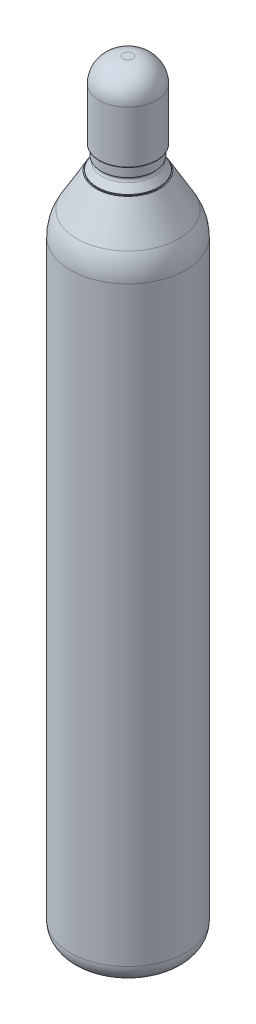
ISO-10303-21;
HEADER;
FILE_DESCRIPTION(('STEP AP214'),'2;1');
FILE_NAME('part.step','',(''),(''),'','','');
FILE_SCHEMA(('AUTOMOTIVE_DESIGN { 1 0 10303 214 1 1 1 1 }'));
ENDSEC;
DATA;
#1=APPLICATION_CONTEXT('core data for automotive mechanical design processes');
#2=APPLICATION_PROTOCOL_DEFINITION('international standard','automotive_design',2000,#1);
#3=PRODUCT_CONTEXT('',#1,'mechanical');
#4=PRODUCT('Part','Part','',(#3));
#5=PRODUCT_RELATED_PRODUCT_CATEGORY('part','',(#4));
#6=PRODUCT_DEFINITION_FORMATION('','',#4);
#7=PRODUCT_DEFINITION_CONTEXT('part definition',#1,'design');
#8=PRODUCT_DEFINITION('design','',#6,#7);
#9=PRODUCT_DEFINITION_SHAPE('','',#8);
#10=(LENGTH_UNIT() NAMED_UNIT(*) SI_UNIT(.MILLI.,.METRE.));
#11=(NAMED_UNIT(*) PLANE_ANGLE_UNIT() SI_UNIT($,.RADIAN.));
#12=(NAMED_UNIT(*) SI_UNIT($,.STERADIAN.) SOLID_ANGLE_UNIT());
#13=UNCERTAINTY_MEASURE_WITH_UNIT(LENGTH_MEASURE(1.E-05),#10,'distance_accuracy_value','');
#14=(GEOMETRIC_REPRESENTATION_CONTEXT(3) GLOBAL_UNCERTAINTY_ASSIGNED_CONTEXT((#13)) GLOBAL_UNIT_ASSIGNED_CONTEXT((#10,
#11,#12)) REPRESENTATION_CONTEXT('',''));
#15=CARTESIAN_POINT('',(0.,0.,0.));
#16=DIRECTION('',(0.,0.,1.));
#17=DIRECTION('',(1.,0.,0.));
#18=AXIS2_PLACEMENT_3D('',#15,#16,#17);
#19=CARTESIAN_POINT('',(-4.99999999999982,800.,0.));
#20=DIRECTION('',(0.,1.,0.));
#21=DIRECTION('',(0.,0.,1.));
#22=AXIS2_PLACEMENT_3D('',#19,#20,#21);
#23=PLANE('',#22);
#24=CARTESIAN_POINT('',(0.,800.,0.));
#25=DIRECTION('',(0.,1.,0.));
#26=DIRECTION('',(0.,0.,1.));
#27=AXIS2_PLACEMENT_3D('',#24,#25,#26);
#28=CIRCLE('',#27,4.99999999999983);
#29=CARTESIAN_POINT('',(0.,800.,4.99999999999983));
#30=VERTEX_POINT('',#29);
#31=EDGE_CURVE('E83',#30,#30,#28,.T.);
#32=ORIENTED_EDGE('',*,*,#31,.T.);
#33=EDGE_LOOP('',(#32));
#34=FACE_BOUND('',#33,.T.);
#35=ADVANCED_FACE('F32',(#34),#23,.T.);
#36=CARTESIAN_POINT('',(0.,775.,0.));
#37=DIRECTION('',(0.,1.,0.));
#38=DIRECTION('',(0.,0.,1.));
#39=AXIS2_PLACEMENT_3D('',#36,#37,#38);
#40=DEGENERATE_TOROIDAL_SURFACE('',#39,5.,25.,.T.);
#41=CARTESIAN_POINT('',(0.,775.,0.));
#42=DIRECTION('',(0.,1.,0.));
#43=DIRECTION('',(0.,0.,1.));
#44=AXIS2_PLACEMENT_3D('',#41,#42,#43);
#45=CIRCLE('',#44,30.);
#46=CARTESIAN_POINT('',(0.,775.,30.));
#47=VERTEX_POINT('',#46);
#48=EDGE_CURVE('E86',#47,#47,#45,.T.);
#49=ORIENTED_EDGE('',*,*,#48,.T.);
#50=EDGE_LOOP('',(#49));
#51=FACE_BOUND('',#50,.T.);
#52=ORIENTED_EDGE('',*,*,#31,.F.);
#53=EDGE_LOOP('',(#52));
#54=FACE_BOUND('',#53,.T.);
#55=ADVANCED_FACE('F148',(#51,#54),#40,.T.);
#56=CARTESIAN_POINT('',(0.,0.,0.));
#57=DIRECTION('',(0.,1.,0.));
#58=DIRECTION('',(0.,0.,1.));
#59=AXIS2_PLACEMENT_3D('',#56,#57,#58);
#60=CYLINDRICAL_SURFACE('',#59,30.);
#61=CARTESIAN_POINT('',(0.,721.,0.));
#62=DIRECTION('',(0.,1.,0.));
#63=DIRECTION('',(0.,0.,1.));
#64=AXIS2_PLACEMENT_3D('',#61,#62,#63);
#65=CIRCLE('',#64,30.);
#66=CARTESIAN_POINT('',(0.,721.,30.));
#67=VERTEX_POINT('',#66);
#68=EDGE_CURVE('E89',#67,#67,#65,.T.);
#69=ORIENTED_EDGE('',*,*,#68,.T.);
#70=EDGE_LOOP('',(#69));
#71=FACE_BOUND('',#70,.T.);
#72=ORIENTED_EDGE('',*,*,#48,.F.);
#73=EDGE_LOOP('',(#72));
#74=FACE_BOUND('',#73,.T.);
#75=ADVANCED_FACE('F154',(#71,#74),#60,.T.);
#76=CARTESIAN_POINT('',(0.,721.,0.));
#77=DIRECTION('',(0.,1.,0.));
#78=DIRECTION('',(0.,0.,1.));
#79=AXIS2_PLACEMENT_3D('',#76,#77,#78);
#80=TOROIDAL_SURFACE('',#79,29.,1.);
#81=CARTESIAN_POINT('',(0.,720.,0.));
#82=DIRECTION('',(0.,1.,0.));
#83=DIRECTION('',(0.,0.,1.));
#84=AXIS2_PLACEMENT_3D('',#81,#82,#83);
#85=CIRCLE('',#84,29.);
#86=CARTESIAN_POINT('',(0.,720.,29.));
#87=VERTEX_POINT('',#86);
#88=EDGE_CURVE('E92',#87,#87,#85,.T.);
#89=ORIENTED_EDGE('',*,*,#88,.T.);
#90=EDGE_LOOP('',(#89));
#91=FACE_BOUND('',#90,.T.);
#92=ORIENTED_EDGE('',*,*,#68,.F.);
#93=EDGE_LOOP('',(#92));
#94=FACE_BOUND('',#93,.T.);
#95=ADVANCED_FACE('F429',(#91,#94),#80,.T.);
#96=CARTESIAN_POINT('',(-29.,720.,0.));
#97=DIRECTION('',(0.,-1.,0.));
#98=DIRECTION('',(0.,0.,-1.));
#99=AXIS2_PLACEMENT_3D('',#96,#97,#98);
#100=PLANE('',#99);
#101=CARTESIAN_POINT('',(0.,720.,0.));
#102=DIRECTION('',(0.,1.,0.));
#103=DIRECTION('',(0.,0.,1.));
#104=AXIS2_PLACEMENT_3D('',#101,#102,#103);
#105=CIRCLE('',#104,28.9);
#106=CARTESIAN_POINT('',(0.,720.,28.9));
#107=VERTEX_POINT('',#106);
#108=EDGE_CURVE('E95',#107,#107,#105,.T.);
#109=ORIENTED_EDGE('',*,*,#108,.T.);
#110=EDGE_LOOP('',(#109));
#111=FACE_BOUND('',#110,.T.);
#112=ORIENTED_EDGE('',*,*,#88,.F.);
#113=EDGE_LOOP('',(#112));
#114=FACE_BOUND('',#113,.T.);
#115=ADVANCED_FACE('F419',(#111,#114),#100,.T.);
#116=CARTESIAN_POINT('',(0.,719.1,0.));
#117=DIRECTION('',(0.,1.,0.));
#118=DIRECTION('',(0.,0.,1.));
#119=AXIS2_PLACEMENT_3D('',#116,#117,#118);
#120=TOROIDAL_SURFACE('',#119,28.9,0.900000000000005);
#121=CARTESIAN_POINT('',(0.,719.1,0.));
#122=DIRECTION('',(0.,1.,0.));
#123=DIRECTION('',(0.,0.,1.));
#124=AXIS2_PLACEMENT_3D('',#121,#122,#123);
#125=CIRCLE('',#124,28.);
#126=CARTESIAN_POINT('',(0.,719.1,28.));
#127=VERTEX_POINT('',#126);
#128=EDGE_CURVE('E98',#127,#127,#125,.T.);
#129=ORIENTED_EDGE('',*,*,#128,.T.);
#130=EDGE_LOOP('',(#129));
#131=FACE_BOUND('',#130,.T.);
#132=ORIENTED_EDGE('',*,*,#108,.F.);
#133=EDGE_LOOP('',(#132));
#134=FACE_BOUND('',#133,.T.);
#135=ADVANCED_FACE('F409',(#131,#134),#120,.F.);
#136=CARTESIAN_POINT('',(0.,0.,0.));
#137=DIRECTION('',(0.,1.,0.));
#138=DIRECTION('',(0.,0.,1.));
#139=AXIS2_PLACEMENT_3D('',#136,#137,#138);
#140=CYLINDRICAL_SURFACE('',#139,28.);
#141=CARTESIAN_POINT('',(0.,710.,0.));
#142=DIRECTION('',(0.,1.,0.));
#143=DIRECTION('',(0.,0.,1.));
#144=AXIS2_PLACEMENT_3D('',#141,#142,#143);
#145=CIRCLE('',#144,28.);
#146=CARTESIAN_POINT('',(0.,710.,28.));
#147=VERTEX_POINT('',#146);
#148=EDGE_CURVE('E101',#147,#147,#145,.T.);
#149=ORIENTED_EDGE('',*,*,#148,.T.);
#150=EDGE_LOOP('',(#149));
#151=FACE_BOUND('',#150,.T.);
#152=ORIENTED_EDGE('',*,*,#128,.F.);
#153=EDGE_LOOP('',(#152));
#154=FACE_BOUND('',#153,.T.);
#155=ADVANCED_FACE('F399',(#151,#154),#140,.T.);
#156=CARTESIAN_POINT('',(-28.,710.,0.));
#157=DIRECTION('',(0.,-1.,0.));
#158=DIRECTION('',(0.,0.,-1.));
#159=AXIS2_PLACEMENT_3D('',#156,#157,#158);
#160=PLANE('',#159);
#161=CARTESIAN_POINT('',(0.,710.,0.));
#162=DIRECTION('',(0.,1.,0.));
#163=DIRECTION('',(0.,0.,1.));
#164=AXIS2_PLACEMENT_3D('',#161,#162,#163);
#165=CIRCLE('',#164,26.);
#166=CARTESIAN_POINT('',(0.,710.,26.));
#167=VERTEX_POINT('',#166);
#168=EDGE_CURVE('E104',#167,#167,#165,.T.);
#169=ORIENTED_EDGE('',*,*,#168,.T.);
#170=EDGE_LOOP('',(#169));
#171=FACE_BOUND('',#170,.T.);
#172=ORIENTED_EDGE('',*,*,#148,.F.);
#173=EDGE_LOOP('',(#172));
#174=FACE_BOUND('',#173,.T.);
#175=ADVANCED_FACE('F389',(#171,#174),#160,.T.);
#176=CARTESIAN_POINT('',(0.,0.,0.));
#177=DIRECTION('',(0.,1.,0.));
#178=DIRECTION('',(0.,0.,1.));
#179=AXIS2_PLACEMENT_3D('',#176,#177,#178);
#180=CYLINDRICAL_SURFACE('',#179,26.);
#181=CARTESIAN_POINT('',(0.,707.623068324057,0.));
#182=DIRECTION('',(0.,1.,0.));
#183=DIRECTION('',(0.,0.,1.));
#184=AXIS2_PLACEMENT_3D('',#181,#182,#183);
#185=CIRCLE('',#184,26.);
#186=CARTESIAN_POINT('',(0.,707.623068324057,26.));
#187=VERTEX_POINT('',#186);
#188=EDGE_CURVE('E107',#187,#187,#185,.T.);
#189=ORIENTED_EDGE('',*,*,#188,.T.);
#190=EDGE_LOOP('',(#189));
#191=FACE_BOUND('',#190,.T.);
#192=ORIENTED_EDGE('',*,*,#168,.F.);
#193=EDGE_LOOP('',(#192));
#194=FACE_BOUND('',#193,.T.);
#195=ADVANCED_FACE('F379',(#191,#194),#180,.T.);
#196=CARTESIAN_POINT('',(0.,707.623068324057,0.));
#197=DIRECTION('',(0.,1.,0.));
#198=DIRECTION('',(0.,0.,1.));
#199=AXIS2_PLACEMENT_3D('',#196,#197,#198);
#200=TOROIDAL_SURFACE('',#199,31.,5.00000000000002);
#201=CARTESIAN_POINT('',(0.,704.686382138247,0.));
#202=DIRECTION('',(0.,1.,0.));
#203=DIRECTION('',(0.,0.,1.));
#204=AXIS2_PLACEMENT_3D('',#201,#202,#203);
#205=CIRCLE('',#204,26.9532884651767);
#206=CARTESIAN_POINT('',(0.,704.686382138247,26.9532884651767));
#207=VERTEX_POINT('',#206);
#208=EDGE_CURVE('E110',#207,#207,#205,.T.);
#209=ORIENTED_EDGE('',*,*,#208,.T.);
#210=EDGE_LOOP('',(#209));
#211=FACE_BOUND('',#210,.T.);
#212=ORIENTED_EDGE('',*,*,#188,.F.);
#213=EDGE_LOOP('',(#212));
#214=FACE_BOUND('',#213,.T.);
#215=ADVANCED_FACE('F369',(#211,#214),#200,.F.);
#216=CARTESIAN_POINT('',(0.,704.686382138247,0.));
#217=DIRECTION('',(0.,-1.,0.));
#218=DIRECTION('',(0.,0.,-1.));
#219=AXIS2_PLACEMENT_3D('',#216,#217,#218);
#220=CONICAL_SURFACE('',#219,26.9532884651767,0.627764864892792);
#221=CARTESIAN_POINT('',(0.,697.602540378444,0.));
#222=DIRECTION('',(0.,1.,0.));
#223=DIRECTION('',(0.,0.,1.));
#224=AXIS2_PLACEMENT_3D('',#221,#222,#223);
#225=CIRCLE('',#224,32.0940107675849);
#226=CARTESIAN_POINT('',(0.,697.602540378444,32.0940107675849));
#227=VERTEX_POINT('',#226);
#228=EDGE_CURVE('E113',#227,#227,#225,.T.);
#229=ORIENTED_EDGE('',*,*,#228,.T.);
#230=EDGE_LOOP('',(#229));
#231=FACE_BOUND('',#230,.T.);
#232=ORIENTED_EDGE('',*,*,#208,.F.);
#233=EDGE_LOOP('',(#232));
#234=FACE_BOUND('',#233,.T.);
#235=ADVANCED_FACE('F359',(#231,#234),#220,.T.);
#236=CARTESIAN_POINT('',(0.,0.,0.));
#237=DIRECTION('',(0.,1.,0.));
#238=DIRECTION('',(0.,0.,1.));
#239=AXIS2_PLACEMENT_3D('',#236,#237,#238);
#240=CYLINDRICAL_SURFACE('',#239,32.0940107675849);
#241=CARTESIAN_POINT('',(0.,696.602540378444,0.));
#242=DIRECTION('',(0.,1.,0.));
#243=DIRECTION('',(0.,0.,1.));
#244=AXIS2_PLACEMENT_3D('',#241,#242,#243);
#245=CIRCLE('',#244,32.0940107675849);
#246=CARTESIAN_POINT('',(0.,696.602540378444,32.0940107675849));
#247=VERTEX_POINT('',#246);
#248=EDGE_CURVE('E116',#247,#247,#245,.T.);
#249=ORIENTED_EDGE('',*,*,#248,.T.);
#250=EDGE_LOOP('',(#249));
#251=FACE_BOUND('',#250,.T.);
#252=ORIENTED_EDGE('',*,*,#228,.F.);
#253=EDGE_LOOP('',(#252));
#254=FACE_BOUND('',#253,.T.);
#255=ADVANCED_FACE('F349',(#251,#254),#240,.T.);
#256=CARTESIAN_POINT('',(-33.0940107675849,696.602540378444,0.));
#257=DIRECTION('',(0.,1.,0.));
#258=DIRECTION('',(0.,0.,1.));
#259=AXIS2_PLACEMENT_3D('',#256,#257,#258);
#260=PLANE('',#259);
#261=CARTESIAN_POINT('',(0.,696.602540378444,0.));
#262=DIRECTION('',(0.,1.,0.));
#263=DIRECTION('',(0.,0.,1.));
#264=AXIS2_PLACEMENT_3D('',#261,#262,#263);
#265=CIRCLE('',#264,33.0940107675849);
#266=CARTESIAN_POINT('',(0.,696.602540378444,33.0940107675849));
#267=VERTEX_POINT('',#266);
#268=EDGE_CURVE('E119',#267,#267,#265,.T.);
#269=ORIENTED_EDGE('',*,*,#268,.T.);
#270=EDGE_LOOP('',(#269));
#271=FACE_BOUND('',#270,.T.);
#272=ORIENTED_EDGE('',*,*,#248,.F.);
#273=EDGE_LOOP('',(#272));
#274=FACE_BOUND('',#273,.T.);
#275=ADVANCED_FACE('F339',(#271,#274),#260,.T.);
#276=CARTESIAN_POINT('',(0.,696.602540378444,0.));
#277=DIRECTION('',(0.,-1.,0.));
#278=DIRECTION('',(0.,0.,-1.));
#279=AXIS2_PLACEMENT_3D('',#276,#277,#278);
#280=CONICAL_SURFACE('',#279,33.0940107675849,0.523598775598302);
#281=CARTESIAN_POINT('',(0.,661.602540378444,0.));
#282=DIRECTION('',(0.,1.,0.));
#283=DIRECTION('',(0.,0.,1.));
#284=AXIS2_PLACEMENT_3D('',#281,#282,#283);
#285=CIRCLE('',#284,53.3012701892218);
#286=CARTESIAN_POINT('',(0.,661.602540378444,53.3012701892218));
#287=VERTEX_POINT('',#286);
#288=EDGE_CURVE('E122',#287,#287,#285,.T.);
#289=ORIENTED_EDGE('',*,*,#288,.T.);
#290=EDGE_LOOP('',(#289));
#291=FACE_BOUND('',#290,.T.);
#292=ORIENTED_EDGE('',*,*,#268,.F.);
#293=EDGE_LOOP('',(#292));
#294=FACE_BOUND('',#293,.T.);
#295=ADVANCED_FACE('F329',(#291,#294),#280,.T.);
#296=CARTESIAN_POINT('',(0.,636.602540378444,0.));
#297=DIRECTION('',(0.,1.,0.));
#298=DIRECTION('',(0.,0.,1.));
#299=AXIS2_PLACEMENT_3D('',#296,#297,#298);
#300=DEGENERATE_TOROIDAL_SURFACE('',#299,9.99999999999999,50.,.T.);
#301=CARTESIAN_POINT('',(0.,636.602540378444,0.));
#302=DIRECTION('',(0.,1.,0.));
#303=DIRECTION('',(0.,0.,1.));
#304=AXIS2_PLACEMENT_3D('',#301,#302,#303);
#305=CIRCLE('',#304,60.);
#306=CARTESIAN_POINT('',(0.,636.602540378444,60.));
#307=VERTEX_POINT('',#306);
#308=EDGE_CURVE('E125',#307,#307,#305,.T.);
#309=ORIENTED_EDGE('',*,*,#308,.T.);
#310=EDGE_LOOP('',(#309));
#311=FACE_BOUND('',#310,.T.);
#312=ORIENTED_EDGE('',*,*,#288,.F.);
#313=EDGE_LOOP('',(#312));
#314=FACE_BOUND('',#313,.T.);
#315=ADVANCED_FACE('F319',(#311,#314),#300,.T.);
#316=CARTESIAN_POINT('',(0.,0.,0.));
#317=DIRECTION('',(0.,1.,0.));
#318=DIRECTION('',(0.,0.,1.));
#319=AXIS2_PLACEMENT_3D('',#316,#317,#318);
#320=CYLINDRICAL_SURFACE('',#319,60.);
#321=CARTESIAN_POINT('',(0.,20.0000000000001,0.));
#322=DIRECTION('',(0.,1.,0.));
#323=DIRECTION('',(0.,0.,1.));
#324=AXIS2_PLACEMENT_3D('',#321,#322,#323);
#325=CIRCLE('',#324,60.);
#326=CARTESIAN_POINT('',(0.,20.0000000000001,60.));
#327=VERTEX_POINT('',#326);
#328=EDGE_CURVE('E128',#327,#327,#325,.T.);
#329=ORIENTED_EDGE('',*,*,#328,.T.);
#330=EDGE_LOOP('',(#329));
#331=FACE_BOUND('',#330,.T.);
#332=ORIENTED_EDGE('',*,*,#308,.F.);
#333=EDGE_LOOP('',(#332));
#334=FACE_BOUND('',#333,.T.);
#335=ADVANCED_FACE('F145',(#331,#334),#320,.T.);
#336=CARTESIAN_POINT('',(0.,20.,0.));
#337=DIRECTION('',(0.,1.,0.));
#338=DIRECTION('',(0.,0.,1.));
#339=AXIS2_PLACEMENT_3D('',#336,#337,#338);
#340=TOROIDAL_SURFACE('',#339,40.,20.);
#341=CARTESIAN_POINT('',(0.,0.,0.));
#342=DIRECTION('',(0.,1.,0.));
#343=DIRECTION('',(0.,0.,1.));
#344=AXIS2_PLACEMENT_3D('',#341,#342,#343);
#345=CIRCLE('',#344,39.9999999999999);
#346=CARTESIAN_POINT('',(0.,0.,39.9999999999999));
#347=VERTEX_POINT('',#346);
#348=EDGE_CURVE('E131',#347,#347,#345,.T.);
#349=ORIENTED_EDGE('',*,*,#348,.T.);
#350=EDGE_LOOP('',(#349));
#351=FACE_BOUND('',#350,.T.);
#352=ORIENTED_EDGE('',*,*,#328,.F.);
#353=EDGE_LOOP('',(#352));
#354=FACE_BOUND('',#353,.T.);
#355=ADVANCED_FACE('F135',(#351,#354),#340,.T.);
#356=CARTESIAN_POINT('',(0.,0.,0.));
#357=DIRECTION('',(0.,-1.,0.));
#358=DIRECTION('',(0.,0.,-1.));
#359=AXIS2_PLACEMENT_3D('',#356,#357,#358);
#360=PLANE('',#359);
#361=ORIENTED_EDGE('',*,*,#348,.F.);
#362=EDGE_LOOP('',(#361));
#363=FACE_BOUND('',#362,.T.);
#364=ADVANCED_FACE('F138',(#363),#360,.T.);
#365=CLOSED_SHELL('',(#35,#55,#75,#95,#115,#135,#155,#175,#195,#215,#235,#255,#275,#295,#315,
#335,#355,#364));
#366=CARTESIAN_POINT('',(0.,5.,0.));
#367=DIRECTION('',(0.,1.,0.));
#368=DIRECTION('',(0.,0.,1.));
#369=AXIS2_PLACEMENT_3D('',#366,#367,#368);
#370=PLANE('',#369);
#371=CARTESIAN_POINT('',(0.,5.,0.));
#372=DIRECTION('',(0.,1.,0.));
#373=DIRECTION('',(0.,0.,1.));
#374=AXIS2_PLACEMENT_3D('',#371,#372,#373);
#375=CIRCLE('',#374,39.9999999999999);
#376=CARTESIAN_POINT('',(0.,5.,39.9999999999999));
#377=VERTEX_POINT('',#376);
#378=EDGE_CURVE('E10',#377,#377,#375,.T.);
#379=ORIENTED_EDGE('',*,*,#378,.T.);
#380=EDGE_LOOP('',(#379));
#381=FACE_BOUND('',#380,.T.);
#382=ADVANCED_FACE('F34',(#381),#370,.T.);
#383=CARTESIAN_POINT('',(0.,20.,0.));
#384=DIRECTION('',(0.,1.,0.));
#385=DIRECTION('',(0.,0.,1.));
#386=AXIS2_PLACEMENT_3D('',#383,#384,#385);
#387=TOROIDAL_SURFACE('',#386,40.,15.);
#388=CARTESIAN_POINT('',(0.,20.0000000000001,0.));
#389=DIRECTION('',(0.,1.,0.));
#390=DIRECTION('',(0.,0.,1.));
#391=AXIS2_PLACEMENT_3D('',#388,#389,#390);
#392=CIRCLE('',#391,55.);
#393=CARTESIAN_POINT('',(0.,20.0000000000001,55.));
#394=VERTEX_POINT('',#393);
#395=EDGE_CURVE('E40',#394,#394,#392,.T.);
#396=ORIENTED_EDGE('',*,*,#395,.T.);
#397=EDGE_LOOP('',(#396));
#398=FACE_BOUND('',#397,.T.);
#399=ORIENTED_EDGE('',*,*,#378,.F.);
#400=EDGE_LOOP('',(#399));
#401=FACE_BOUND('',#400,.T.);
#402=ADVANCED_FACE('F210',(#398,#401),#387,.F.);
#403=CARTESIAN_POINT('',(0.,0.,0.));
#404=DIRECTION('',(0.,1.,0.));
#405=DIRECTION('',(0.,0.,1.));
#406=AXIS2_PLACEMENT_3D('',#403,#404,#405);
#407=CYLINDRICAL_SURFACE('',#406,55.);
#408=CARTESIAN_POINT('',(0.,636.602540378444,0.));
#409=DIRECTION('',(0.,1.,0.));
#410=DIRECTION('',(0.,0.,1.));
#411=AXIS2_PLACEMENT_3D('',#408,#409,#410);
#412=CIRCLE('',#411,55.);
#413=CARTESIAN_POINT('',(0.,636.602540378444,55.));
#414=VERTEX_POINT('',#413);
#415=EDGE_CURVE('E44',#414,#414,#412,.T.);
#416=ORIENTED_EDGE('',*,*,#415,.T.);
#417=EDGE_LOOP('',(#416));
#418=FACE_BOUND('',#417,.T.);
#419=ORIENTED_EDGE('',*,*,#395,.F.);
#420=EDGE_LOOP('',(#419));
#421=FACE_BOUND('',#420,.T.);
#422=ADVANCED_FACE('F207',(#418,#421),#407,.F.);
#423=CARTESIAN_POINT('',(0.,636.602540378444,0.));
#424=DIRECTION('',(0.,1.,0.));
#425=DIRECTION('',(0.,0.,1.));
#426=AXIS2_PLACEMENT_3D('',#423,#424,#425);
#427=DEGENERATE_TOROIDAL_SURFACE('',#426,9.99999999999999,45.,.T.);
#428=CARTESIAN_POINT('',(0.,659.102540378444,0.));
#429=DIRECTION('',(0.,1.,0.));
#430=DIRECTION('',(0.,0.,1.));
#431=AXIS2_PLACEMENT_3D('',#428,#429,#430);
#432=CIRCLE('',#431,48.9711431702997);
#433=CARTESIAN_POINT('',(0.,659.102540378444,48.9711431702997));
#434=VERTEX_POINT('',#433);
#435=EDGE_CURVE('E48',#434,#434,#432,.T.);
#436=ORIENTED_EDGE('',*,*,#435,.T.);
#437=EDGE_LOOP('',(#436));
#438=FACE_BOUND('',#437,.T.);
#439=ORIENTED_EDGE('',*,*,#415,.F.);
#440=EDGE_LOOP('',(#439));
#441=FACE_BOUND('',#440,.T.);
#442=ADVANCED_FACE('F203',(#438,#441),#427,.F.);
#443=CARTESIAN_POINT('',(0.,659.102540378444,0.));
#444=DIRECTION('',(0.,-1.,0.));
#445=DIRECTION('',(0.,0.,-1.));
#446=AXIS2_PLACEMENT_3D('',#443,#444,#445);
#447=CONICAL_SURFACE('',#446,48.9711431702997,0.523598775598304);
#448=CARTESIAN_POINT('',(0.,691.602540378444,0.));
#449=DIRECTION('',(0.,1.,0.));
#450=DIRECTION('',(0.,0.,1.));
#451=AXIS2_PLACEMENT_3D('',#448,#449,#450);
#452=CIRCLE('',#451,30.2072594216367);
#453=CARTESIAN_POINT('',(0.,691.602540378444,30.2072594216367));
#454=VERTEX_POINT('',#453);
#455=EDGE_CURVE('E53',#454,#454,#452,.T.);
#456=ORIENTED_EDGE('',*,*,#455,.T.);
#457=EDGE_LOOP('',(#456));
#458=FACE_BOUND('',#457,.T.);
#459=ORIENTED_EDGE('',*,*,#435,.F.);
#460=EDGE_LOOP('',(#459));
#461=FACE_BOUND('',#460,.T.);
#462=ADVANCED_FACE('F199',(#458,#461),#447,.F.);
#463=CARTESIAN_POINT('',(-30.2072594216367,691.602540378444,0.));
#464=DIRECTION('',(0.,-1.,0.));
#465=DIRECTION('',(0.,0.,-1.));
#466=AXIS2_PLACEMENT_3D('',#463,#464,#465);
#467=PLANE('',#466);
#468=CARTESIAN_POINT('',(0.,691.602540378444,0.));
#469=DIRECTION('',(0.,1.,0.));
#470=DIRECTION('',(0.,0.,1.));
#471=AXIS2_PLACEMENT_3D('',#468,#469,#470);
#472=CIRCLE('',#471,27.0940107675849);
#473=CARTESIAN_POINT('',(0.,691.602540378444,27.0940107675849));
#474=VERTEX_POINT('',#473);
#475=EDGE_CURVE('E56',#474,#474,#472,.T.);
#476=ORIENTED_EDGE('',*,*,#475,.T.);
#477=EDGE_LOOP('',(#476));
#478=FACE_BOUND('',#477,.T.);
#479=ORIENTED_EDGE('',*,*,#455,.F.);
#480=EDGE_LOOP('',(#479));
#481=FACE_BOUND('',#480,.T.);
#482=ADVANCED_FACE('F195',(#478,#481),#467,.T.);
#483=CARTESIAN_POINT('',(0.,0.,0.));
#484=DIRECTION('',(0.,1.,0.));
#485=DIRECTION('',(0.,0.,1.));
#486=AXIS2_PLACEMENT_3D('',#483,#484,#485);
#487=CYLINDRICAL_SURFACE('',#486,27.0940107675849);
#488=CARTESIAN_POINT('',(0.,695.979472054387,0.));
#489=DIRECTION('',(0.,1.,0.));
#490=DIRECTION('',(0.,0.,1.));
#491=AXIS2_PLACEMENT_3D('',#488,#489,#490);
#492=CIRCLE('',#491,27.0940107675849);
#493=CARTESIAN_POINT('',(0.,695.979472054387,27.0940107675849));
#494=VERTEX_POINT('',#493);
#495=EDGE_CURVE('E59',#494,#494,#492,.T.);
#496=ORIENTED_EDGE('',*,*,#495,.T.);
#497=EDGE_LOOP('',(#496));
#498=FACE_BOUND('',#497,.T.);
#499=ORIENTED_EDGE('',*,*,#475,.F.);
#500=EDGE_LOOP('',(#499));
#501=FACE_BOUND('',#500,.T.);
#502=ADVANCED_FACE('F191',(#498,#501),#487,.F.);
#503=CARTESIAN_POINT('',(0.,695.979472054387,0.));
#504=DIRECTION('',(0.,-1.,0.));
#505=DIRECTION('',(0.,0.,-1.));
#506=AXIS2_PLACEMENT_3D('',#503,#504,#505);
#507=CONICAL_SURFACE('',#506,27.0940107675849,0.62776486489279);
#508=CARTESIAN_POINT('',(0.,704.376931675943,0.));
#509=DIRECTION('',(0.,1.,0.));
#510=DIRECTION('',(0.,0.,1.));
#511=AXIS2_PLACEMENT_3D('',#508,#509,#510);
#512=CIRCLE('',#511,21.);
#513=CARTESIAN_POINT('',(0.,704.376931675943,21.));
#514=VERTEX_POINT('',#513);
#515=EDGE_CURVE('E62',#514,#514,#512,.T.);
#516=ORIENTED_EDGE('',*,*,#515,.T.);
#517=EDGE_LOOP('',(#516));
#518=FACE_BOUND('',#517,.T.);
#519=ORIENTED_EDGE('',*,*,#495,.F.);
#520=EDGE_LOOP('',(#519));
#521=FACE_BOUND('',#520,.T.);
#522=ADVANCED_FACE('F187',(#518,#521),#507,.F.);
#523=CARTESIAN_POINT('',(0.,0.,0.));
#524=DIRECTION('',(0.,1.,0.));
#525=DIRECTION('',(0.,0.,1.));
#526=AXIS2_PLACEMENT_3D('',#523,#524,#525);
#527=CYLINDRICAL_SURFACE('',#526,21.);
#528=CARTESIAN_POINT('',(0.,715.,0.));
#529=DIRECTION('',(0.,1.,0.));
#530=DIRECTION('',(0.,0.,1.));
#531=AXIS2_PLACEMENT_3D('',#528,#529,#530);
#532=CIRCLE('',#531,21.);
#533=CARTESIAN_POINT('',(0.,715.,21.));
#534=VERTEX_POINT('',#533);
#535=EDGE_CURVE('E65',#534,#534,#532,.T.);
#536=ORIENTED_EDGE('',*,*,#535,.T.);
#537=EDGE_LOOP('',(#536));
#538=FACE_BOUND('',#537,.T.);
#539=ORIENTED_EDGE('',*,*,#515,.F.);
#540=EDGE_LOOP('',(#539));
#541=FACE_BOUND('',#540,.T.);
#542=ADVANCED_FACE('F183',(#538,#541),#527,.F.);
#543=CARTESIAN_POINT('',(-23.,715.,0.));
#544=DIRECTION('',(0.,1.,0.));
#545=DIRECTION('',(0.,0.,1.));
#546=AXIS2_PLACEMENT_3D('',#543,#544,#545);
#547=PLANE('',#546);
#548=CARTESIAN_POINT('',(0.,715.,0.));
#549=DIRECTION('',(0.,1.,0.));
#550=DIRECTION('',(0.,0.,1.));
#551=AXIS2_PLACEMENT_3D('',#548,#549,#550);
#552=CIRCLE('',#551,23.);
#553=CARTESIAN_POINT('',(0.,715.,23.));
#554=VERTEX_POINT('',#553);
#555=EDGE_CURVE('E68',#554,#554,#552,.T.);
#556=ORIENTED_EDGE('',*,*,#555,.T.);
#557=EDGE_LOOP('',(#556));
#558=FACE_BOUND('',#557,.T.);
#559=ORIENTED_EDGE('',*,*,#535,.F.);
#560=EDGE_LOOP('',(#559));
#561=FACE_BOUND('',#560,.T.);
#562=ADVANCED_FACE('F179',(#558,#561),#547,.T.);
#563=CARTESIAN_POINT('',(0.,0.,0.));
#564=DIRECTION('',(0.,1.,0.));
#565=DIRECTION('',(0.,0.,1.));
#566=AXIS2_PLACEMENT_3D('',#563,#564,#565);
#567=CYLINDRICAL_SURFACE('',#566,23.);
#568=CARTESIAN_POINT('',(0.,725.,0.));
#569=DIRECTION('',(0.,1.,0.));
#570=DIRECTION('',(0.,0.,1.));
#571=AXIS2_PLACEMENT_3D('',#568,#569,#570);
#572=CIRCLE('',#571,23.);
#573=CARTESIAN_POINT('',(0.,725.,23.));
#574=VERTEX_POINT('',#573);
#575=EDGE_CURVE('E71',#574,#574,#572,.T.);
#576=ORIENTED_EDGE('',*,*,#575,.T.);
#577=EDGE_LOOP('',(#576));
#578=FACE_BOUND('',#577,.T.);
#579=ORIENTED_EDGE('',*,*,#555,.F.);
#580=EDGE_LOOP('',(#579));
#581=FACE_BOUND('',#580,.T.);
#582=ADVANCED_FACE('F175',(#578,#581),#567,.F.);
#583=CARTESIAN_POINT('',(-25.,725.,0.));
#584=DIRECTION('',(0.,1.,0.));
#585=DIRECTION('',(0.,0.,1.));
#586=AXIS2_PLACEMENT_3D('',#583,#584,#585);
#587=PLANE('',#586);
#588=CARTESIAN_POINT('',(0.,725.,0.));
#589=DIRECTION('',(0.,1.,0.));
#590=DIRECTION('',(0.,0.,1.));
#591=AXIS2_PLACEMENT_3D('',#588,#589,#590);
#592=CIRCLE('',#591,25.);
#593=CARTESIAN_POINT('',(0.,725.,25.));
#594=VERTEX_POINT('',#593);
#595=EDGE_CURVE('E74',#594,#594,#592,.T.);
#596=ORIENTED_EDGE('',*,*,#595,.T.);
#597=EDGE_LOOP('',(#596));
#598=FACE_BOUND('',#597,.T.);
#599=ORIENTED_EDGE('',*,*,#575,.F.);
#600=EDGE_LOOP('',(#599));
#601=FACE_BOUND('',#600,.T.);
#602=ADVANCED_FACE('F171',(#598,#601),#587,.T.);
#603=CARTESIAN_POINT('',(0.,0.,0.));
#604=DIRECTION('',(0.,1.,0.));
#605=DIRECTION('',(0.,0.,1.));
#606=AXIS2_PLACEMENT_3D('',#603,#604,#605);
#607=CYLINDRICAL_SURFACE('',#606,25.);
#608=CARTESIAN_POINT('',(0.,775.,0.));
#609=DIRECTION('',(0.,1.,0.));
#610=DIRECTION('',(0.,0.,1.));
#611=AXIS2_PLACEMENT_3D('',#608,#609,#610);
#612=CIRCLE('',#611,25.);
#613=CARTESIAN_POINT('',(0.,775.,25.));
#614=VERTEX_POINT('',#613);
#615=EDGE_CURVE('E77',#614,#614,#612,.T.);
#616=ORIENTED_EDGE('',*,*,#615,.T.);
#617=EDGE_LOOP('',(#616));
#618=FACE_BOUND('',#617,.T.);
#619=ORIENTED_EDGE('',*,*,#595,.F.);
#620=EDGE_LOOP('',(#619));
#621=FACE_BOUND('',#620,.T.);
#622=ADVANCED_FACE('F167',(#618,#621),#607,.F.);
#623=CARTESIAN_POINT('',(0.,775.,0.));
#624=DIRECTION('',(0.,1.,0.));
#625=DIRECTION('',(0.,0.,1.));
#626=AXIS2_PLACEMENT_3D('',#623,#624,#625);
#627=DEGENERATE_TOROIDAL_SURFACE('',#626,5.,20.,.T.);
#628=CARTESIAN_POINT('',(0.,795.,0.));
#629=DIRECTION('',(0.,1.,0.));
#630=DIRECTION('',(0.,0.,1.));
#631=AXIS2_PLACEMENT_3D('',#628,#629,#630);
#632=CIRCLE('',#631,4.99999999999986);
#633=CARTESIAN_POINT('',(0.,795.,4.99999999999986));
#634=VERTEX_POINT('',#633);
#635=EDGE_CURVE('E80',#634,#634,#632,.T.);
#636=ORIENTED_EDGE('',*,*,#635,.T.);
#637=EDGE_LOOP('',(#636));
#638=FACE_BOUND('',#637,.T.);
#639=ORIENTED_EDGE('',*,*,#615,.F.);
#640=EDGE_LOOP('',(#639));
#641=FACE_BOUND('',#640,.T.);
#642=ADVANCED_FACE('F162',(#638,#641),#627,.F.);
#643=CARTESIAN_POINT('',(-4.99999999999986,795.,0.));
#644=DIRECTION('',(0.,-1.,0.));
#645=DIRECTION('',(0.,0.,-1.));
#646=AXIS2_PLACEMENT_3D('',#643,#644,#645);
#647=PLANE('',#646);
#648=ORIENTED_EDGE('',*,*,#635,.F.);
#649=EDGE_LOOP('',(#648));
#650=FACE_BOUND('',#649,.T.);
#651=ADVANCED_FACE('F159',(#650),#647,.T.);
#652=CLOSED_SHELL('',(#382,#402,#422,#442,#462,#482,#502,#522,#542,#562,#582,#602,#622,#642,#651));
#653=ORIENTED_CLOSED_SHELL('',*,#652,.T.);
#654=BREP_WITH_VOIDS('B2',#365,(#653));
#655=ADVANCED_BREP_SHAPE_REPRESENTATION('',(#18,#654),#14);
#656=SHAPE_DEFINITION_REPRESENTATION(#9,#655);
ENDSEC;
END-ISO-10303-21;
